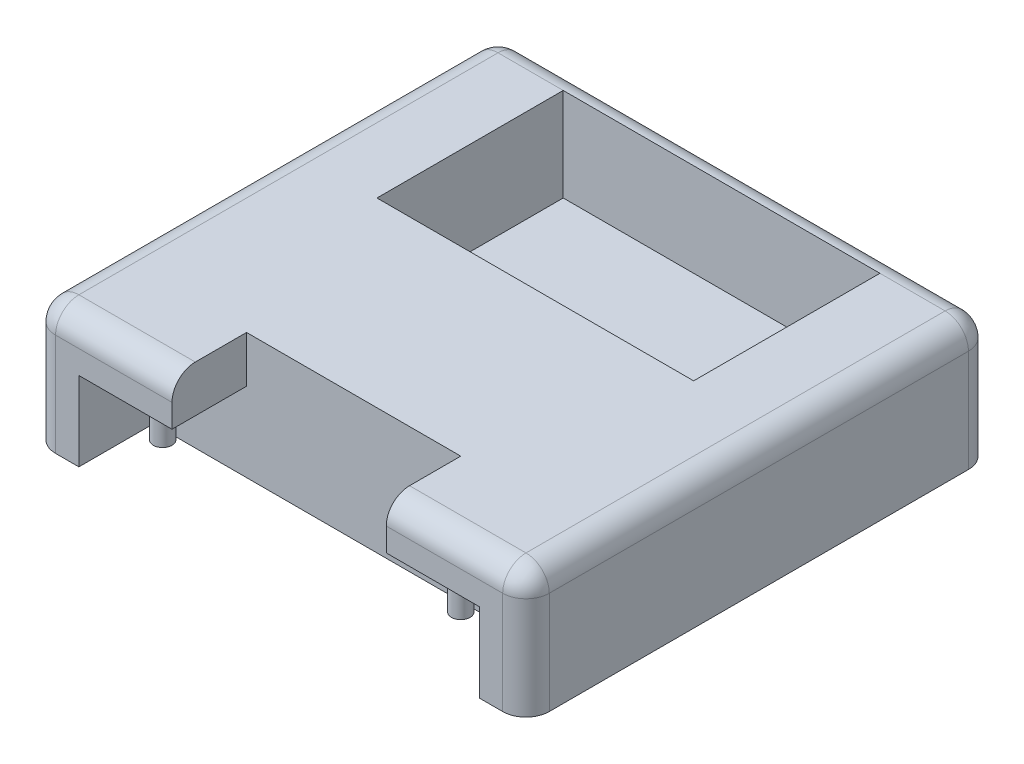
ISO-10303-21;
HEADER;
FILE_DESCRIPTION(('STEP AP214'),'2;1');
FILE_NAME('part.step','',(''),(''),'','','');
FILE_SCHEMA(('AUTOMOTIVE_DESIGN { 1 0 10303 214 1 1 1 1 }'));
ENDSEC;
DATA;
#1=APPLICATION_CONTEXT('core data for automotive mechanical design processes');
#2=APPLICATION_PROTOCOL_DEFINITION('international standard','automotive_design',2000,#1);
#3=PRODUCT_CONTEXT('',#1,'mechanical');
#4=PRODUCT('Part','Part','',(#3));
#5=PRODUCT_RELATED_PRODUCT_CATEGORY('part','',(#4));
#6=PRODUCT_DEFINITION_FORMATION('','',#4);
#7=PRODUCT_DEFINITION_CONTEXT('part definition',#1,'design');
#8=PRODUCT_DEFINITION('design','',#6,#7);
#9=PRODUCT_DEFINITION_SHAPE('','',#8);
#10=(LENGTH_UNIT() NAMED_UNIT(*) SI_UNIT(.MILLI.,.METRE.));
#11=(NAMED_UNIT(*) PLANE_ANGLE_UNIT() SI_UNIT($,.RADIAN.));
#12=(NAMED_UNIT(*) SI_UNIT($,.STERADIAN.) SOLID_ANGLE_UNIT());
#13=UNCERTAINTY_MEASURE_WITH_UNIT(LENGTH_MEASURE(1.E-05),#10,'distance_accuracy_value','');
#14=(GEOMETRIC_REPRESENTATION_CONTEXT(3) GLOBAL_UNCERTAINTY_ASSIGNED_CONTEXT((#13)) GLOBAL_UNIT_ASSIGNED_CONTEXT((#10,
#11,#12)) REPRESENTATION_CONTEXT('',''));
#15=CARTESIAN_POINT('',(0.,0.,0.));
#16=DIRECTION('',(0.,0.,1.));
#17=DIRECTION('',(1.,0.,0.));
#18=AXIS2_PLACEMENT_3D('',#15,#16,#17);
#19=CARTESIAN_POINT('',(0.,0.,0.));
#20=DIRECTION('',(0.,-1.,0.));
#21=DIRECTION('',(0.,0.,-1.));
#22=AXIS2_PLACEMENT_3D('',#19,#20,#21);
#23=PLANE('',#22);
#24=CARTESIAN_POINT('',(32.,0.,43.));
#25=DIRECTION('',(0.,-1.,0.));
#26=DIRECTION('',(0.,0.,-1.));
#27=AXIS2_PLACEMENT_3D('',#24,#25,#26);
#28=CIRCLE('',#27,5.);
#29=CARTESIAN_POINT('',(32.,0.,38.));
#30=VERTEX_POINT('',#29);
#31=EDGE_CURVE('E258',#30,#30,#28,.F.);
#32=ORIENTED_EDGE('',*,*,#31,.T.);
#33=EDGE_LOOP('',(#32));
#34=FACE_BOUND('',#33,.T.);
#35=DIRECTION('',(0.,0.,1.));
#36=VECTOR('',#35,1.);
#37=CARTESIAN_POINT('',(23.,0.,66.));
#38=LINE('',#37,#36);
#39=CARTESIAN_POINT('',(23.,0.,34.));
#40=VERTEX_POINT('',#39);
#41=CARTESIAN_POINT('',(23.,0.,50.));
#42=VERTEX_POINT('',#41);
#43=EDGE_CURVE('E198',#40,#42,#38,.T.);
#44=ORIENTED_EDGE('',*,*,#43,.F.);
#45=DIRECTION('',(-1.,0.,0.));
#46=VECTOR('',#45,1.);
#47=CARTESIAN_POINT('',(-43.,0.,34.));
#48=LINE('',#47,#46);
#49=CARTESIAN_POINT('',(43.,0.,34.));
#50=VERTEX_POINT('',#49);
#51=EDGE_CURVE('E212',#50,#40,#48,.T.);
#52=ORIENTED_EDGE('',*,*,#51,.F.);
#53=DIRECTION('',(0.,0.,-1.));
#54=VECTOR('',#53,1.);
#55=CARTESIAN_POINT('',(43.,0.,50.));
#56=LINE('',#55,#54);
#57=CARTESIAN_POINT('',(43.,0.,50.));
#58=VERTEX_POINT('',#57);
#59=EDGE_CURVE('E227',#58,#50,#56,.T.);
#60=ORIENTED_EDGE('',*,*,#59,.F.);
#61=DIRECTION('',(1.,0.,0.));
#62=VECTOR('',#61,1.);
#63=CARTESIAN_POINT('',(-53.,0.,50.));
#64=LINE('',#63,#62);
#65=EDGE_CURVE('E213',#42,#58,#64,.T.);
#66=ORIENTED_EDGE('',*,*,#65,.F.);
#67=EDGE_LOOP('',(#44,#52,#60,#66));
#68=FACE_BOUND('',#67,.T.);
#69=ADVANCED_FACE('F39',(#34,#68),#23,.T.);
#70=CARTESIAN_POINT('',(-53.,10.,50.));
#71=DIRECTION('',(0.,0.,-1.));
#72=DIRECTION('',(-1.,0.,0.));
#73=AXIS2_PLACEMENT_3D('',#70,#71,#72);
#74=PLANE('',#73);
#75=DIRECTION('',(0.,-1.,0.));
#76=VECTOR('',#75,1.);
#77=CARTESIAN_POINT('',(48.,10.,50.));
#78=LINE('',#77,#76);
#79=CARTESIAN_POINT('',(48.,-17.,50.));
#80=VERTEX_POINT('',#79);
#81=CARTESIAN_POINT('',(48.,5.,50.));
#82=VERTEX_POINT('',#81);
#83=EDGE_CURVE('E280',#80,#82,#78,.F.);
#84=ORIENTED_EDGE('',*,*,#83,.T.);
#85=DIRECTION('',(1.,0.,0.));
#86=VECTOR('',#85,1.);
#87=CARTESIAN_POINT('',(-53.,5.,50.));
#88=LINE('',#87,#86);
#89=CARTESIAN_POINT('',(23.,5.,50.));
#90=VERTEX_POINT('',#89);
#91=EDGE_CURVE('E282',#82,#90,#88,.F.);
#92=ORIENTED_EDGE('',*,*,#91,.T.);
#93=DIRECTION('',(0.,-1.,0.));
#94=VECTOR('',#93,1.);
#95=CARTESIAN_POINT('',(23.,10.,50.));
#96=LINE('',#95,#94);
#97=EDGE_CURVE('E457',#90,#42,#96,.T.);
#98=ORIENTED_EDGE('',*,*,#97,.T.);
#99=ORIENTED_EDGE('',*,*,#65,.T.);
#100=DIRECTION('',(0.,1.,0.));
#101=VECTOR('',#100,1.);
#102=CARTESIAN_POINT('',(43.,-17.,50.));
#103=LINE('',#102,#101);
#104=CARTESIAN_POINT('',(43.,-17.,50.));
#105=VERTEX_POINT('',#104);
#106=EDGE_CURVE('E238',#105,#58,#103,.T.);
#107=ORIENTED_EDGE('',*,*,#106,.F.);
#108=DIRECTION('',(-1.,0.,0.));
#109=VECTOR('',#108,1.);
#110=CARTESIAN_POINT('',(53.,-17.,50.));
#111=LINE('',#110,#109);
#112=EDGE_CURVE('E383',#80,#105,#111,.T.);
#113=ORIENTED_EDGE('',*,*,#112,.F.);
#114=EDGE_LOOP('',(#84,#92,#98,#99,#107,#113));
#115=FACE_BOUND('',#114,.T.);
#116=ADVANCED_FACE('F470',(#115),#74,.F.);
#117=CARTESIAN_POINT('',(-32.,0.,43.));
#118=DIRECTION('',(0.,-1.,0.));
#119=DIRECTION('',(0.,0.,-1.));
#120=AXIS2_PLACEMENT_3D('',#117,#118,#119);
#121=CIRCLE('',#120,5.);
#122=CARTESIAN_POINT('',(-32.,0.,38.));
#123=VERTEX_POINT('',#122);
#124=EDGE_CURVE('E264',#123,#123,#121,.F.);
#125=ORIENTED_EDGE('',*,*,#124,.T.);
#126=EDGE_LOOP('',(#125));
#127=FACE_BOUND('',#126,.T.);
#128=DIRECTION('',(0.,0.,-1.));
#129=VECTOR('',#128,1.);
#130=CARTESIAN_POINT('',(-23.,0.,66.));
#131=LINE('',#130,#129);
#132=CARTESIAN_POINT('',(-23.,0.,50.));
#133=VERTEX_POINT('',#132);
#134=CARTESIAN_POINT('',(-23.,0.,34.));
#135=VERTEX_POINT('',#134);
#136=EDGE_CURVE('E214',#133,#135,#131,.T.);
#137=ORIENTED_EDGE('',*,*,#136,.F.);
#138=CARTESIAN_POINT('',(-43.,0.,50.));
#139=VERTEX_POINT('',#138);
#140=EDGE_CURVE('E247',#139,#133,#64,.T.);
#141=ORIENTED_EDGE('',*,*,#140,.F.);
#142=DIRECTION('',(0.,0.,1.));
#143=VECTOR('',#142,1.);
#144=CARTESIAN_POINT('',(-43.,0.,50.));
#145=LINE('',#144,#143);
#146=CARTESIAN_POINT('',(-43.,0.,34.));
#147=VERTEX_POINT('',#146);
#148=EDGE_CURVE('E221',#147,#139,#145,.T.);
#149=ORIENTED_EDGE('',*,*,#148,.F.);
#150=EDGE_CURVE('E222',#135,#147,#48,.T.);
#151=ORIENTED_EDGE('',*,*,#150,.F.);
#152=EDGE_LOOP('',(#137,#141,#149,#151));
#153=FACE_BOUND('',#152,.T.);
#154=ADVANCED_FACE('F413',(#127,#153),#23,.T.);
#155=CARTESIAN_POINT('',(53.,10.,50.));
#156=DIRECTION('',(-1.,0.,0.));
#157=DIRECTION('',(0.,0.,1.));
#158=AXIS2_PLACEMENT_3D('',#155,#156,#157);
#159=PLANE('',#158);
#160=DIRECTION('',(0.,0.,1.));
#161=VECTOR('',#160,1.);
#162=CARTESIAN_POINT('',(53.,-17.,50.));
#163=LINE('',#162,#161);
#164=CARTESIAN_POINT('',(53.,-17.,-45.));
#165=VERTEX_POINT('',#164);
#166=CARTESIAN_POINT('',(53.,-17.,45.));
#167=VERTEX_POINT('',#166);
#168=EDGE_CURVE('E375',#165,#167,#163,.T.);
#169=ORIENTED_EDGE('',*,*,#168,.F.);
#170=DIRECTION('',(0.,-1.,0.));
#171=VECTOR('',#170,1.);
#172=CARTESIAN_POINT('',(53.,10.,-45.));
#173=LINE('',#172,#171);
#174=CARTESIAN_POINT('',(53.,5.,-45.));
#175=VERTEX_POINT('',#174);
#176=EDGE_CURVE('E310',#165,#175,#173,.F.);
#177=ORIENTED_EDGE('',*,*,#176,.T.);
#178=DIRECTION('',(0.,0.,-1.));
#179=VECTOR('',#178,1.);
#180=CARTESIAN_POINT('',(53.,5.,50.));
#181=LINE('',#180,#179);
#182=CARTESIAN_POINT('',(53.,5.,45.));
#183=VERTEX_POINT('',#182);
#184=EDGE_CURVE('E306',#175,#183,#181,.F.);
#185=ORIENTED_EDGE('',*,*,#184,.T.);
#186=DIRECTION('',(0.,-1.,0.));
#187=VECTOR('',#186,1.);
#188=CARTESIAN_POINT('',(53.,10.,45.));
#189=LINE('',#188,#187);
#190=EDGE_CURVE('E308',#183,#167,#189,.T.);
#191=ORIENTED_EDGE('',*,*,#190,.T.);
#192=EDGE_LOOP('',(#169,#177,#185,#191));
#193=FACE_BOUND('',#192,.T.);
#194=ADVANCED_FACE('F494',(#193),#159,.F.);
#195=CARTESIAN_POINT('',(-53.,10.,-50.));
#196=DIRECTION('',(0.,0.,1.));
#197=DIRECTION('',(1.,0.,0.));
#198=AXIS2_PLACEMENT_3D('',#195,#196,#197);
#199=PLANE('',#198);
#200=DIRECTION('',(-1.,0.,0.));
#201=VECTOR('',#200,1.);
#202=CARTESIAN_POINT('',(-53.,5.,-50.));
#203=LINE('',#202,#201);
#204=CARTESIAN_POINT('',(-48.,5.,-50.));
#205=VERTEX_POINT('',#204);
#206=CARTESIAN_POINT('',(48.,5.,-50.));
#207=VERTEX_POINT('',#206);
#208=EDGE_CURVE('E292',#205,#207,#203,.F.);
#209=ORIENTED_EDGE('',*,*,#208,.T.);
#210=DIRECTION('',(0.,-1.,0.));
#211=VECTOR('',#210,1.);
#212=CARTESIAN_POINT('',(48.,10.,-50.));
#213=LINE('',#212,#211);
#214=CARTESIAN_POINT('',(48.,-17.,-50.));
#215=VERTEX_POINT('',#214);
#216=EDGE_CURVE('E296',#207,#215,#213,.T.);
#217=ORIENTED_EDGE('',*,*,#216,.T.);
#218=DIRECTION('',(1.,0.,0.));
#219=VECTOR('',#218,1.);
#220=CARTESIAN_POINT('',(-53.,-17.,-50.));
#221=LINE('',#220,#219);
#222=CARTESIAN_POINT('',(-48.,-17.,-50.));
#223=VERTEX_POINT('',#222);
#224=EDGE_CURVE('E373',#223,#215,#221,.T.);
#225=ORIENTED_EDGE('',*,*,#224,.F.);
#226=DIRECTION('',(0.,-1.,0.));
#227=VECTOR('',#226,1.);
#228=CARTESIAN_POINT('',(-48.,10.,-50.));
#229=LINE('',#228,#227);
#230=EDGE_CURVE('E294',#223,#205,#229,.F.);
#231=ORIENTED_EDGE('',*,*,#230,.T.);
#232=EDGE_LOOP('',(#209,#217,#225,#231));
#233=FACE_BOUND('',#232,.T.);
#234=ADVANCED_FACE('F506',(#233),#199,.F.);
#235=CARTESIAN_POINT('',(-53.,10.,50.));
#236=DIRECTION('',(1.,0.,0.));
#237=DIRECTION('',(0.,0.,-1.));
#238=AXIS2_PLACEMENT_3D('',#235,#236,#237);
#239=PLANE('',#238);
#240=DIRECTION('',(0.,0.,-1.));
#241=VECTOR('',#240,1.);
#242=CARTESIAN_POINT('',(-53.,-17.,50.));
#243=LINE('',#242,#241);
#244=CARTESIAN_POINT('',(-53.,-17.,45.));
#245=VERTEX_POINT('',#244);
#246=CARTESIAN_POINT('',(-53.,-17.,-45.));
#247=VERTEX_POINT('',#246);
#248=EDGE_CURVE('E225',#245,#247,#243,.T.);
#249=ORIENTED_EDGE('',*,*,#248,.F.);
#250=DIRECTION('',(0.,-1.,0.));
#251=VECTOR('',#250,1.);
#252=CARTESIAN_POINT('',(-53.,10.,45.));
#253=LINE('',#252,#251);
#254=CARTESIAN_POINT('',(-53.,5.,45.));
#255=VERTEX_POINT('',#254);
#256=EDGE_CURVE('E11',#245,#255,#253,.F.);
#257=ORIENTED_EDGE('',*,*,#256,.T.);
#258=DIRECTION('',(0.,0.,1.));
#259=VECTOR('',#258,1.);
#260=CARTESIAN_POINT('',(-53.,5.,50.));
#261=LINE('',#260,#259);
#262=CARTESIAN_POINT('',(-53.,5.,-45.));
#263=VERTEX_POINT('',#262);
#264=EDGE_CURVE('E55',#255,#263,#261,.F.);
#265=ORIENTED_EDGE('',*,*,#264,.T.);
#266=DIRECTION('',(0.,-1.,0.));
#267=VECTOR('',#266,1.);
#268=CARTESIAN_POINT('',(-53.,10.,-45.));
#269=LINE('',#268,#267);
#270=EDGE_CURVE('E48',#263,#247,#269,.T.);
#271=ORIENTED_EDGE('',*,*,#270,.T.);
#272=EDGE_LOOP('',(#249,#257,#265,#271));
#273=FACE_BOUND('',#272,.T.);
#274=ADVANCED_FACE('F366',(#273),#239,.F.);
#275=DIRECTION('',(0.,1.,0.));
#276=VECTOR('',#275,1.);
#277=CARTESIAN_POINT('',(-23.,10.,50.));
#278=LINE('',#277,#276);
#279=CARTESIAN_POINT('',(-23.,5.,50.));
#280=VERTEX_POINT('',#279);
#281=EDGE_CURVE('E206',#133,#280,#278,.T.);
#282=ORIENTED_EDGE('',*,*,#281,.T.);
#283=DIRECTION('',(1.,0.,0.));
#284=VECTOR('',#283,1.);
#285=CARTESIAN_POINT('',(-53.,5.,50.));
#286=LINE('',#285,#284);
#287=CARTESIAN_POINT('',(-48.,5.,50.));
#288=VERTEX_POINT('',#287);
#289=EDGE_CURVE('E290',#280,#288,#286,.F.);
#290=ORIENTED_EDGE('',*,*,#289,.T.);
#291=DIRECTION('',(0.,-1.,0.));
#292=VECTOR('',#291,1.);
#293=CARTESIAN_POINT('',(-48.,10.,50.));
#294=LINE('',#293,#292);
#295=CARTESIAN_POINT('',(-48.,-17.,50.));
#296=VERTEX_POINT('',#295);
#297=EDGE_CURVE('E288',#288,#296,#294,.T.);
#298=ORIENTED_EDGE('',*,*,#297,.T.);
#299=DIRECTION('',(-1.,0.,0.));
#300=VECTOR('',#299,1.);
#301=CARTESIAN_POINT('',(-53.,-17.,50.));
#302=LINE('',#301,#300);
#303=CARTESIAN_POINT('',(-43.,-17.,50.));
#304=VERTEX_POINT('',#303);
#305=EDGE_CURVE('E234',#304,#296,#302,.T.);
#306=ORIENTED_EDGE('',*,*,#305,.F.);
#307=DIRECTION('',(0.,1.,0.));
#308=VECTOR('',#307,1.);
#309=CARTESIAN_POINT('',(-43.,-17.,50.));
#310=LINE('',#309,#308);
#311=EDGE_CURVE('E231',#304,#139,#310,.T.);
#312=ORIENTED_EDGE('',*,*,#311,.T.);
#313=ORIENTED_EDGE('',*,*,#140,.T.);
#314=EDGE_LOOP('',(#282,#290,#298,#306,#312,#313));
#315=FACE_BOUND('',#314,.T.);
#316=ADVANCED_FACE('F398',(#315),#74,.F.);
#317=CARTESIAN_POINT('',(0.,10.,0.));
#318=DIRECTION('',(0.,-1.,0.));
#319=DIRECTION('',(0.,0.,-1.));
#320=AXIS2_PLACEMENT_3D('',#317,#318,#319);
#321=PLANE('',#320);
#322=DIRECTION('',(0.,0.,1.));
#323=VECTOR('',#322,1.);
#324=CARTESIAN_POINT('',(23.,10.,0.));
#325=LINE('',#324,#323);
#326=CARTESIAN_POINT('',(23.,10.,34.));
#327=VERTEX_POINT('',#326);
#328=CARTESIAN_POINT('',(23.,10.,45.));
#329=VERTEX_POINT('',#328);
#330=EDGE_CURVE('E201',#327,#329,#325,.T.);
#331=ORIENTED_EDGE('',*,*,#330,.T.);
#332=DIRECTION('',(1.,0.,0.));
#333=VECTOR('',#332,1.);
#334=CARTESIAN_POINT('',(0.,10.,45.));
#335=LINE('',#334,#333);
#336=CARTESIAN_POINT('',(48.,10.,45.));
#337=VERTEX_POINT('',#336);
#338=EDGE_CURVE('E277',#329,#337,#335,.T.);
#339=ORIENTED_EDGE('',*,*,#338,.T.);
#340=DIRECTION('',(0.,0.,-1.));
#341=VECTOR('',#340,1.);
#342=CARTESIAN_POINT('',(48.,10.,0.));
#343=LINE('',#342,#341);
#344=CARTESIAN_POINT('',(48.,10.,-45.));
#345=VERTEX_POINT('',#344);
#346=EDGE_CURVE('E273',#337,#345,#343,.T.);
#347=ORIENTED_EDGE('',*,*,#346,.T.);
#348=DIRECTION('',(-1.,0.,0.));
#349=VECTOR('',#348,1.);
#350=CARTESIAN_POINT('',(0.,10.,-45.));
#351=LINE('',#350,#349);
#352=CARTESIAN_POINT('',(34.,10.,-45.));
#353=VERTEX_POINT('',#352);
#354=EDGE_CURVE('E275',#345,#353,#351,.T.);
#355=ORIENTED_EDGE('',*,*,#354,.T.);
#356=DIRECTION('',(0.,0.,-1.));
#357=VECTOR('',#356,1.);
#358=CARTESIAN_POINT('',(34.,10.,-4.99999999999999));
#359=LINE('',#358,#357);
#360=CARTESIAN_POINT('',(34.,10.,-4.99999999999999));
#361=VERTEX_POINT('',#360);
#362=EDGE_CURVE('E454',#361,#353,#359,.T.);
#363=ORIENTED_EDGE('',*,*,#362,.F.);
#364=DIRECTION('',(1.,0.,0.));
#365=VECTOR('',#364,1.);
#366=CARTESIAN_POINT('',(-34.,10.,-4.99999999999999));
#367=LINE('',#366,#365);
#368=CARTESIAN_POINT('',(-34.,10.,-4.99999999999999));
#369=VERTEX_POINT('',#368);
#370=EDGE_CURVE('E432',#369,#361,#367,.T.);
#371=ORIENTED_EDGE('',*,*,#370,.F.);
#372=DIRECTION('',(0.,0.,1.));
#373=VECTOR('',#372,1.);
#374=CARTESIAN_POINT('',(-34.,10.,-4.99999999999999));
#375=LINE('',#374,#373);
#376=CARTESIAN_POINT('',(-34.,10.,-45.));
#377=VERTEX_POINT('',#376);
#378=EDGE_CURVE('E458',#377,#369,#375,.T.);
#379=ORIENTED_EDGE('',*,*,#378,.F.);
#380=DIRECTION('',(-1.,0.,0.));
#381=VECTOR('',#380,1.);
#382=CARTESIAN_POINT('',(0.,10.,-45.));
#383=LINE('',#382,#381);
#384=CARTESIAN_POINT('',(-48.,10.,-45.));
#385=VERTEX_POINT('',#384);
#386=EDGE_CURVE('E269',#377,#385,#383,.T.);
#387=ORIENTED_EDGE('',*,*,#386,.T.);
#388=DIRECTION('',(0.,0.,1.));
#389=VECTOR('',#388,1.);
#390=CARTESIAN_POINT('',(-48.,10.,0.));
#391=LINE('',#390,#389);
#392=CARTESIAN_POINT('',(-48.,10.,45.));
#393=VERTEX_POINT('',#392);
#394=EDGE_CURVE('E267',#385,#393,#391,.T.);
#395=ORIENTED_EDGE('',*,*,#394,.T.);
#396=DIRECTION('',(1.,0.,0.));
#397=VECTOR('',#396,1.);
#398=CARTESIAN_POINT('',(0.,10.,45.));
#399=LINE('',#398,#397);
#400=CARTESIAN_POINT('',(-23.,10.,45.));
#401=VERTEX_POINT('',#400);
#402=EDGE_CURVE('E271',#393,#401,#399,.T.);
#403=ORIENTED_EDGE('',*,*,#402,.T.);
#404=DIRECTION('',(0.,0.,-1.));
#405=VECTOR('',#404,1.);
#406=CARTESIAN_POINT('',(-23.,10.,0.));
#407=LINE('',#406,#405);
#408=CARTESIAN_POINT('',(-23.,10.,34.));
#409=VERTEX_POINT('',#408);
#410=EDGE_CURVE('E250',#401,#409,#407,.T.);
#411=ORIENTED_EDGE('',*,*,#410,.T.);
#412=DIRECTION('',(1.,0.,0.));
#413=VECTOR('',#412,1.);
#414=CARTESIAN_POINT('',(0.,10.,34.));
#415=LINE('',#414,#413);
#416=EDGE_CURVE('E252',#409,#327,#415,.T.);
#417=ORIENTED_EDGE('',*,*,#416,.T.);
#418=EDGE_LOOP('',(#331,#339,#347,#355,#363,#371,#379,#387,#395,#403,#411,#417));
#419=FACE_BOUND('',#418,.T.);
#420=ADVANCED_FACE('F407',(#419),#321,.F.);
#421=CARTESIAN_POINT('',(32.,-10.,43.));
#422=DIRECTION('',(0.,1.,0.));
#423=DIRECTION('',(0.,0.,1.));
#424=AXIS2_PLACEMENT_3D('',#421,#422,#423);
#425=CYLINDRICAL_SURFACE('',#424,2.);
#426=CARTESIAN_POINT('',(32.,-3.,43.));
#427=DIRECTION('',(0.,-1.,0.));
#428=DIRECTION('',(0.,0.,-1.));
#429=AXIS2_PLACEMENT_3D('',#426,#427,#428);
#430=CIRCLE('',#429,2.);
#431=CARTESIAN_POINT('',(32.,-3.,41.));
#432=VERTEX_POINT('',#431);
#433=EDGE_CURVE('E255',#432,#432,#430,.T.);
#434=ORIENTED_EDGE('',*,*,#433,.T.);
#435=EDGE_LOOP('',(#434));
#436=FACE_BOUND('',#435,.T.);
#437=CARTESIAN_POINT('',(32.,-10.,43.));
#438=DIRECTION('',(0.,-1.,0.));
#439=DIRECTION('',(0.,0.,-1.));
#440=AXIS2_PLACEMENT_3D('',#437,#438,#439);
#441=CIRCLE('',#440,2.);
#442=CARTESIAN_POINT('',(32.,-10.,41.));
#443=VERTEX_POINT('',#442);
#444=EDGE_CURVE('E241',#443,#443,#441,.T.);
#445=ORIENTED_EDGE('',*,*,#444,.F.);
#446=EDGE_LOOP('',(#445));
#447=FACE_BOUND('',#446,.T.);
#448=ADVANCED_FACE('F563',(#436,#447),#425,.T.);
#449=CARTESIAN_POINT('',(32.,-10.,43.));
#450=DIRECTION('',(0.,-1.,0.));
#451=DIRECTION('',(0.,0.,-1.));
#452=AXIS2_PLACEMENT_3D('',#449,#450,#451);
#453=PLANE('',#452);
#454=ORIENTED_EDGE('',*,*,#444,.T.);
#455=EDGE_LOOP('',(#454));
#456=FACE_BOUND('',#455,.T.);
#457=ADVANCED_FACE('F550',(#456),#453,.T.);
#458=CARTESIAN_POINT('',(-32.,-10.,43.));
#459=DIRECTION('',(0.,1.,0.));
#460=DIRECTION('',(0.,0.,1.));
#461=AXIS2_PLACEMENT_3D('',#458,#459,#460);
#462=CYLINDRICAL_SURFACE('',#461,2.);
#463=CARTESIAN_POINT('',(-32.,-3.,43.));
#464=DIRECTION('',(0.,-1.,0.));
#465=DIRECTION('',(0.,0.,-1.));
#466=AXIS2_PLACEMENT_3D('',#463,#464,#465);
#467=CIRCLE('',#466,2.);
#468=CARTESIAN_POINT('',(-32.,-3.,41.));
#469=VERTEX_POINT('',#468);
#470=EDGE_CURVE('E261',#469,#469,#467,.T.);
#471=ORIENTED_EDGE('',*,*,#470,.T.);
#472=EDGE_LOOP('',(#471));
#473=FACE_BOUND('',#472,.T.);
#474=CARTESIAN_POINT('',(-32.,-10.,43.));
#475=DIRECTION('',(0.,-1.,0.));
#476=DIRECTION('',(0.,0.,-1.));
#477=AXIS2_PLACEMENT_3D('',#474,#475,#476);
#478=CIRCLE('',#477,2.);
#479=CARTESIAN_POINT('',(-32.,-10.,41.));
#480=VERTEX_POINT('',#479);
#481=EDGE_CURVE('E242',#480,#480,#478,.T.);
#482=ORIENTED_EDGE('',*,*,#481,.F.);
#483=EDGE_LOOP('',(#482));
#484=FACE_BOUND('',#483,.T.);
#485=ADVANCED_FACE('F546',(#473,#484),#462,.T.);
#486=CARTESIAN_POINT('',(-32.,-10.,43.));
#487=DIRECTION('',(0.,-1.,0.));
#488=DIRECTION('',(0.,0.,-1.));
#489=AXIS2_PLACEMENT_3D('',#486,#487,#488);
#490=PLANE('',#489);
#491=ORIENTED_EDGE('',*,*,#481,.T.);
#492=EDGE_LOOP('',(#491));
#493=FACE_BOUND('',#492,.T.);
#494=ADVANCED_FACE('F549',(#493),#490,.T.);
#495=CARTESIAN_POINT('',(43.,-17.,50.));
#496=DIRECTION('',(1.,0.,0.));
#497=DIRECTION('',(0.,0.,-1.));
#498=AXIS2_PLACEMENT_3D('',#495,#496,#497);
#499=PLANE('',#498);
#500=ORIENTED_EDGE('',*,*,#59,.T.);
#501=DIRECTION('',(0.,1.,0.));
#502=VECTOR('',#501,1.);
#503=CARTESIAN_POINT('',(43.,-17.,34.));
#504=LINE('',#503,#502);
#505=CARTESIAN_POINT('',(43.,-17.,34.));
#506=VERTEX_POINT('',#505);
#507=EDGE_CURVE('E220',#506,#50,#504,.T.);
#508=ORIENTED_EDGE('',*,*,#507,.F.);
#509=DIRECTION('',(0.,0.,-1.));
#510=VECTOR('',#509,1.);
#511=CARTESIAN_POINT('',(43.,-17.,50.));
#512=LINE('',#511,#510);
#513=EDGE_CURVE('E385',#105,#506,#512,.T.);
#514=ORIENTED_EDGE('',*,*,#513,.F.);
#515=ORIENTED_EDGE('',*,*,#106,.T.);
#516=EDGE_LOOP('',(#500,#508,#514,#515));
#517=FACE_BOUND('',#516,.T.);
#518=ADVANCED_FACE('F421',(#517),#499,.F.);
#519=CARTESIAN_POINT('',(-43.,-17.,34.));
#520=DIRECTION('',(0.,0.,-1.));
#521=DIRECTION('',(-1.,0.,0.));
#522=AXIS2_PLACEMENT_3D('',#519,#520,#521);
#523=PLANE('',#522);
#524=ORIENTED_EDGE('',*,*,#51,.T.);
#525=DIRECTION('',(0.,-1.,0.));
#526=VECTOR('',#525,1.);
#527=CARTESIAN_POINT('',(23.,20.,34.));
#528=LINE('',#527,#526);
#529=EDGE_CURVE('E194',#327,#40,#528,.T.);
#530=ORIENTED_EDGE('',*,*,#529,.F.);
#531=ORIENTED_EDGE('',*,*,#416,.F.);
#532=DIRECTION('',(0.,-1.,0.));
#533=VECTOR('',#532,1.);
#534=CARTESIAN_POINT('',(-23.,20.,34.));
#535=LINE('',#534,#533);
#536=EDGE_CURVE('E207',#409,#135,#535,.T.);
#537=ORIENTED_EDGE('',*,*,#536,.T.);
#538=ORIENTED_EDGE('',*,*,#150,.T.);
#539=DIRECTION('',(0.,1.,0.));
#540=VECTOR('',#539,1.);
#541=CARTESIAN_POINT('',(-43.,-17.,34.));
#542=LINE('',#541,#540);
#543=CARTESIAN_POINT('',(-43.,-17.,34.));
#544=VERTEX_POINT('',#543);
#545=EDGE_CURVE('E233',#544,#147,#542,.T.);
#546=ORIENTED_EDGE('',*,*,#545,.F.);
#547=DIRECTION('',(-1.,0.,0.));
#548=VECTOR('',#547,1.);
#549=CARTESIAN_POINT('',(-43.,-17.,34.));
#550=LINE('',#549,#548);
#551=EDGE_CURVE('E387',#506,#544,#550,.T.);
#552=ORIENTED_EDGE('',*,*,#551,.F.);
#553=ORIENTED_EDGE('',*,*,#507,.T.);
#554=EDGE_LOOP('',(#524,#530,#531,#537,#538,#546,#552,#553));
#555=FACE_BOUND('',#554,.T.);
#556=ADVANCED_FACE('F217',(#555),#523,.F.);
#557=CARTESIAN_POINT('',(-43.,-17.,50.));
#558=DIRECTION('',(-1.,0.,0.));
#559=DIRECTION('',(0.,0.,1.));
#560=AXIS2_PLACEMENT_3D('',#557,#558,#559);
#561=PLANE('',#560);
#562=ORIENTED_EDGE('',*,*,#148,.T.);
#563=ORIENTED_EDGE('',*,*,#311,.F.);
#564=DIRECTION('',(0.,0.,1.));
#565=VECTOR('',#564,1.);
#566=CARTESIAN_POINT('',(-43.,-17.,50.));
#567=LINE('',#566,#565);
#568=EDGE_CURVE('E389',#544,#304,#567,.T.);
#569=ORIENTED_EDGE('',*,*,#568,.F.);
#570=ORIENTED_EDGE('',*,*,#545,.T.);
#571=EDGE_LOOP('',(#562,#563,#569,#570));
#572=FACE_BOUND('',#571,.T.);
#573=ADVANCED_FACE('F416',(#572),#561,.F.);
#574=CARTESIAN_POINT('',(0.,-17.,0.));
#575=DIRECTION('',(0.,-1.,0.));
#576=DIRECTION('',(0.,0.,-1.));
#577=AXIS2_PLACEMENT_3D('',#574,#575,#576);
#578=PLANE('',#577);
#579=ORIENTED_EDGE('',*,*,#224,.T.);
#580=CARTESIAN_POINT('',(48.,-17.,-45.));
#581=DIRECTION('',(0.,-1.,0.));
#582=DIRECTION('',(0.,0.,-1.));
#583=AXIS2_PLACEMENT_3D('',#580,#581,#582);
#584=CIRCLE('',#583,5.);
#585=EDGE_CURVE('E304',#215,#165,#584,.T.);
#586=ORIENTED_EDGE('',*,*,#585,.T.);
#587=ORIENTED_EDGE('',*,*,#168,.T.);
#588=CARTESIAN_POINT('',(48.,-17.,45.));
#589=DIRECTION('',(0.,-1.,0.));
#590=DIRECTION('',(0.,0.,-1.));
#591=AXIS2_PLACEMENT_3D('',#588,#589,#590);
#592=CIRCLE('',#591,5.);
#593=EDGE_CURVE('E302',#167,#80,#592,.T.);
#594=ORIENTED_EDGE('',*,*,#593,.T.);
#595=ORIENTED_EDGE('',*,*,#112,.T.);
#596=ORIENTED_EDGE('',*,*,#513,.T.);
#597=ORIENTED_EDGE('',*,*,#551,.T.);
#598=ORIENTED_EDGE('',*,*,#568,.T.);
#599=ORIENTED_EDGE('',*,*,#305,.T.);
#600=CARTESIAN_POINT('',(-48.,-17.,45.));
#601=DIRECTION('',(0.,-1.,0.));
#602=DIRECTION('',(0.,0.,-1.));
#603=AXIS2_PLACEMENT_3D('',#600,#601,#602);
#604=CIRCLE('',#603,5.);
#605=EDGE_CURVE('E300',#296,#245,#604,.T.);
#606=ORIENTED_EDGE('',*,*,#605,.T.);
#607=ORIENTED_EDGE('',*,*,#248,.T.);
#608=CARTESIAN_POINT('',(-48.,-17.,-45.));
#609=DIRECTION('',(0.,-1.,0.));
#610=DIRECTION('',(0.,0.,-1.));
#611=AXIS2_PLACEMENT_3D('',#608,#609,#610);
#612=CIRCLE('',#611,5.);
#613=EDGE_CURVE('E298',#247,#223,#612,.T.);
#614=ORIENTED_EDGE('',*,*,#613,.T.);
#615=EDGE_LOOP('',(#579,#586,#587,#594,#595,#596,#597,#598,#599,#606,#607,#614));
#616=FACE_BOUND('',#615,.T.);
#617=ADVANCED_FACE('F369',(#616),#578,.T.);
#618=CARTESIAN_POINT('',(34.,-10.,-4.99999999999999));
#619=DIRECTION('',(1.,0.,0.));
#620=DIRECTION('',(0.,0.,-1.));
#621=AXIS2_PLACEMENT_3D('',#618,#619,#620);
#622=PLANE('',#621);
#623=ORIENTED_EDGE('',*,*,#362,.T.);
#624=DIRECTION('',(0.,1.,0.));
#625=VECTOR('',#624,1.);
#626=CARTESIAN_POINT('',(34.,-10.,-45.));
#627=LINE('',#626,#625);
#628=CARTESIAN_POINT('',(34.,-10.,-45.));
#629=VERTEX_POINT('',#628);
#630=EDGE_CURVE('E378',#629,#353,#627,.T.);
#631=ORIENTED_EDGE('',*,*,#630,.F.);
#632=DIRECTION('',(0.,0.,-1.));
#633=VECTOR('',#632,1.);
#634=CARTESIAN_POINT('',(34.,-10.,-4.99999999999999));
#635=LINE('',#634,#633);
#636=CARTESIAN_POINT('',(34.,-10.,-4.99999999999999));
#637=VERTEX_POINT('',#636);
#638=EDGE_CURVE('E461',#637,#629,#635,.T.);
#639=ORIENTED_EDGE('',*,*,#638,.F.);
#640=DIRECTION('',(0.,1.,0.));
#641=VECTOR('',#640,1.);
#642=CARTESIAN_POINT('',(34.,-10.,-4.99999999999999));
#643=LINE('',#642,#641);
#644=EDGE_CURVE('E422',#637,#361,#643,.T.);
#645=ORIENTED_EDGE('',*,*,#644,.T.);
#646=EDGE_LOOP('',(#623,#631,#639,#645));
#647=FACE_BOUND('',#646,.T.);
#648=ADVANCED_FACE('F507',(#647),#622,.F.);
#649=CARTESIAN_POINT('',(-34.,-10.,-4.99999999999999));
#650=DIRECTION('',(0.,0.,1.));
#651=DIRECTION('',(1.,0.,0.));
#652=AXIS2_PLACEMENT_3D('',#649,#650,#651);
#653=PLANE('',#652);
#654=ORIENTED_EDGE('',*,*,#370,.T.);
#655=ORIENTED_EDGE('',*,*,#644,.F.);
#656=DIRECTION('',(1.,0.,0.));
#657=VECTOR('',#656,1.);
#658=CARTESIAN_POINT('',(-34.,-10.,-4.99999999999999));
#659=LINE('',#658,#657);
#660=CARTESIAN_POINT('',(-34.,-10.,-4.99999999999999));
#661=VERTEX_POINT('',#660);
#662=EDGE_CURVE('E439',#661,#637,#659,.T.);
#663=ORIENTED_EDGE('',*,*,#662,.F.);
#664=DIRECTION('',(0.,1.,0.));
#665=VECTOR('',#664,1.);
#666=CARTESIAN_POINT('',(-34.,-10.,-4.99999999999999));
#667=LINE('',#666,#665);
#668=EDGE_CURVE('E423',#661,#369,#667,.T.);
#669=ORIENTED_EDGE('',*,*,#668,.T.);
#670=EDGE_LOOP('',(#654,#655,#663,#669));
#671=FACE_BOUND('',#670,.T.);
#672=ADVANCED_FACE('F510',(#671),#653,.F.);
#673=CARTESIAN_POINT('',(-34.,-10.,-4.99999999999999));
#674=DIRECTION('',(-1.,0.,0.));
#675=DIRECTION('',(0.,0.,1.));
#676=AXIS2_PLACEMENT_3D('',#673,#674,#675);
#677=PLANE('',#676);
#678=ORIENTED_EDGE('',*,*,#378,.T.);
#679=ORIENTED_EDGE('',*,*,#668,.F.);
#680=DIRECTION('',(0.,0.,1.));
#681=VECTOR('',#680,1.);
#682=CARTESIAN_POINT('',(-34.,-10.,-4.99999999999999));
#683=LINE('',#682,#681);
#684=CARTESIAN_POINT('',(-34.,-10.,-45.));
#685=VERTEX_POINT('',#684);
#686=EDGE_CURVE('E444',#685,#661,#683,.T.);
#687=ORIENTED_EDGE('',*,*,#686,.F.);
#688=DIRECTION('',(0.,1.,0.));
#689=VECTOR('',#688,1.);
#690=CARTESIAN_POINT('',(-34.,-10.,-45.));
#691=LINE('',#690,#689);
#692=EDGE_CURVE('E429',#685,#377,#691,.T.);
#693=ORIENTED_EDGE('',*,*,#692,.T.);
#694=EDGE_LOOP('',(#678,#679,#687,#693));
#695=FACE_BOUND('',#694,.T.);
#696=ADVANCED_FACE('F511',(#695),#677,.F.);
#697=CARTESIAN_POINT('',(-34.,-10.,-45.));
#698=DIRECTION('',(0.,0.,-1.));
#699=DIRECTION('',(-1.,0.,0.));
#700=AXIS2_PLACEMENT_3D('',#697,#698,#699);
#701=PLANE('',#700);
#702=DIRECTION('',(-1.,0.,0.));
#703=VECTOR('',#702,1.);
#704=CARTESIAN_POINT('',(-34.,10.,-45.));
#705=LINE('',#704,#703);
#706=EDGE_CURVE('E456',#353,#377,#705,.T.);
#707=ORIENTED_EDGE('',*,*,#706,.T.);
#708=ORIENTED_EDGE('',*,*,#692,.F.);
#709=DIRECTION('',(-1.,0.,0.));
#710=VECTOR('',#709,1.);
#711=CARTESIAN_POINT('',(-34.,-10.,-45.));
#712=LINE('',#711,#710);
#713=EDGE_CURVE('E450',#629,#685,#712,.T.);
#714=ORIENTED_EDGE('',*,*,#713,.F.);
#715=ORIENTED_EDGE('',*,*,#630,.T.);
#716=EDGE_LOOP('',(#707,#708,#714,#715));
#717=FACE_BOUND('',#716,.T.);
#718=ADVANCED_FACE('F508',(#717),#701,.F.);
#719=CARTESIAN_POINT('',(0.,-10.,0.));
#720=DIRECTION('',(0.,-1.,0.));
#721=DIRECTION('',(0.,0.,-1.));
#722=AXIS2_PLACEMENT_3D('',#719,#720,#721);
#723=PLANE('',#722);
#724=ORIENTED_EDGE('',*,*,#638,.T.);
#725=ORIENTED_EDGE('',*,*,#713,.T.);
#726=ORIENTED_EDGE('',*,*,#686,.T.);
#727=ORIENTED_EDGE('',*,*,#662,.T.);
#728=EDGE_LOOP('',(#724,#725,#726,#727));
#729=FACE_BOUND('',#728,.T.);
#730=ADVANCED_FACE('F509',(#729),#723,.F.);
#731=CARTESIAN_POINT('',(23.,20.,66.));
#732=DIRECTION('',(1.,0.,0.));
#733=DIRECTION('',(0.,0.,-1.));
#734=AXIS2_PLACEMENT_3D('',#731,#732,#733);
#735=PLANE('',#734);
#736=ORIENTED_EDGE('',*,*,#97,.F.);
#737=CARTESIAN_POINT('',(23.,5.,45.));
#738=DIRECTION('',(1.,0.,0.));
#739=DIRECTION('',(0.,0.,-1.));
#740=AXIS2_PLACEMENT_3D('',#737,#738,#739);
#741=CIRCLE('',#740,5.);
#742=EDGE_CURVE('E284',#90,#329,#741,.F.);
#743=ORIENTED_EDGE('',*,*,#742,.T.);
#744=ORIENTED_EDGE('',*,*,#330,.F.);
#745=ORIENTED_EDGE('',*,*,#529,.T.);
#746=ORIENTED_EDGE('',*,*,#43,.T.);
#747=EDGE_LOOP('',(#736,#743,#744,#745,#746));
#748=FACE_BOUND('',#747,.T.);
#749=ADVANCED_FACE('F197',(#748),#735,.F.);
#750=CARTESIAN_POINT('',(-23.,20.,66.));
#751=DIRECTION('',(-1.,0.,0.));
#752=DIRECTION('',(0.,0.,1.));
#753=AXIS2_PLACEMENT_3D('',#750,#751,#752);
#754=PLANE('',#753);
#755=ORIENTED_EDGE('',*,*,#410,.F.);
#756=CARTESIAN_POINT('',(-23.,5.,45.));
#757=DIRECTION('',(-1.,0.,0.));
#758=DIRECTION('',(0.,0.,1.));
#759=AXIS2_PLACEMENT_3D('',#756,#757,#758);
#760=CIRCLE('',#759,5.);
#761=EDGE_CURVE('E286',#401,#280,#760,.F.);
#762=ORIENTED_EDGE('',*,*,#761,.T.);
#763=ORIENTED_EDGE('',*,*,#281,.F.);
#764=ORIENTED_EDGE('',*,*,#136,.T.);
#765=ORIENTED_EDGE('',*,*,#536,.F.);
#766=EDGE_LOOP('',(#755,#762,#763,#764,#765));
#767=FACE_BOUND('',#766,.T.);
#768=ADVANCED_FACE('F402',(#767),#754,.F.);
#769=CARTESIAN_POINT('',(32.,-3.,43.));
#770=DIRECTION('',(0.,-1.,0.));
#771=DIRECTION('',(0.,0.,-1.));
#772=AXIS2_PLACEMENT_3D('',#769,#770,#771);
#773=TOROIDAL_SURFACE('',#772,5.,3.);
#774=ORIENTED_EDGE('',*,*,#31,.F.);
#775=EDGE_LOOP('',(#774));
#776=FACE_BOUND('',#775,.T.);
#777=ORIENTED_EDGE('',*,*,#433,.F.);
#778=EDGE_LOOP('',(#777));
#779=FACE_BOUND('',#778,.T.);
#780=ADVANCED_FACE('F542',(#776,#779),#773,.F.);
#781=CARTESIAN_POINT('',(-32.,-3.,43.));
#782=DIRECTION('',(0.,-1.,0.));
#783=DIRECTION('',(0.,0.,-1.));
#784=AXIS2_PLACEMENT_3D('',#781,#782,#783);
#785=TOROIDAL_SURFACE('',#784,5.,3.);
#786=ORIENTED_EDGE('',*,*,#124,.F.);
#787=EDGE_LOOP('',(#786));
#788=FACE_BOUND('',#787,.T.);
#789=ORIENTED_EDGE('',*,*,#470,.F.);
#790=EDGE_LOOP('',(#789));
#791=FACE_BOUND('',#790,.T.);
#792=ADVANCED_FACE('F539',(#788,#791),#785,.F.);
#793=CARTESIAN_POINT('',(0.,5.,45.));
#794=DIRECTION('',(1.,0.,0.));
#795=DIRECTION('',(0.,0.,-1.));
#796=AXIS2_PLACEMENT_3D('',#793,#794,#795);
#797=CYLINDRICAL_SURFACE('',#796,5.);
#798=ORIENTED_EDGE('',*,*,#761,.F.);
#799=ORIENTED_EDGE('',*,*,#402,.F.);
#800=CARTESIAN_POINT('',(-48.,5.,45.));
#801=DIRECTION('',(-1.,0.,0.));
#802=DIRECTION('',(0.,0.,1.));
#803=AXIS2_PLACEMENT_3D('',#800,#801,#802);
#804=CIRCLE('',#803,5.);
#805=EDGE_CURVE('E43',#288,#393,#804,.T.);
#806=ORIENTED_EDGE('',*,*,#805,.F.);
#807=ORIENTED_EDGE('',*,*,#289,.F.);
#808=EDGE_LOOP('',(#798,#799,#806,#807));
#809=FACE_BOUND('',#808,.T.);
#810=ADVANCED_FACE('F41',(#809),#797,.T.);
#811=CARTESIAN_POINT('',(-48.,10.,45.));
#812=DIRECTION('',(0.,-1.,0.));
#813=DIRECTION('',(0.,0.,-1.));
#814=AXIS2_PLACEMENT_3D('',#811,#812,#813);
#815=CYLINDRICAL_SURFACE('',#814,5.);
#816=ORIENTED_EDGE('',*,*,#605,.F.);
#817=ORIENTED_EDGE('',*,*,#297,.F.);
#818=CARTESIAN_POINT('',(-48.,5.,45.));
#819=DIRECTION('',(0.,1.,0.));
#820=DIRECTION('',(0.,0.,1.));
#821=AXIS2_PLACEMENT_3D('',#818,#819,#820);
#822=CIRCLE('',#821,5.);
#823=EDGE_CURVE('E342',#255,#288,#822,.T.);
#824=ORIENTED_EDGE('',*,*,#823,.F.);
#825=ORIENTED_EDGE('',*,*,#256,.F.);
#826=EDGE_LOOP('',(#816,#817,#824,#825));
#827=FACE_BOUND('',#826,.T.);
#828=ADVANCED_FACE('F396',(#827),#815,.T.);
#829=CARTESIAN_POINT('',(-48.,5.,45.));
#830=DIRECTION('',(0.,0.,1.));
#831=DIRECTION('',(1.,0.,0.));
#832=AXIS2_PLACEMENT_3D('',#829,#830,#831);
#833=SPHERICAL_SURFACE('',#832,5.);
#834=ORIENTED_EDGE('',*,*,#823,.T.);
#835=ORIENTED_EDGE('',*,*,#805,.T.);
#836=CARTESIAN_POINT('',(-48.,5.,45.));
#837=DIRECTION('',(0.,0.,1.));
#838=DIRECTION('',(1.,0.,0.));
#839=AXIS2_PLACEMENT_3D('',#836,#837,#838);
#840=CIRCLE('',#839,5.);
#841=EDGE_CURVE('E340',#255,#393,#840,.F.);
#842=ORIENTED_EDGE('',*,*,#841,.F.);
#843=EDGE_LOOP('',(#834,#835,#842));
#844=FACE_BOUND('',#843,.T.);
#845=ADVANCED_FACE('F348',(#844),#833,.T.);
#846=CARTESIAN_POINT('',(-48.,5.,0.));
#847=DIRECTION('',(0.,0.,1.));
#848=DIRECTION('',(1.,0.,0.));
#849=AXIS2_PLACEMENT_3D('',#846,#847,#848);
#850=CYLINDRICAL_SURFACE('',#849,5.);
#851=ORIENTED_EDGE('',*,*,#841,.T.);
#852=ORIENTED_EDGE('',*,*,#394,.F.);
#853=CARTESIAN_POINT('',(-48.,5.,-45.));
#854=DIRECTION('',(0.,0.,-1.));
#855=DIRECTION('',(0.,1.,0.));
#856=AXIS2_PLACEMENT_3D('',#853,#854,#855);
#857=CIRCLE('',#856,5.);
#858=EDGE_CURVE('E337',#263,#385,#857,.T.);
#859=ORIENTED_EDGE('',*,*,#858,.F.);
#860=ORIENTED_EDGE('',*,*,#264,.F.);
#861=EDGE_LOOP('',(#851,#852,#859,#860));
#862=FACE_BOUND('',#861,.T.);
#863=ADVANCED_FACE('F354',(#862),#850,.T.);
#864=CARTESIAN_POINT('',(-48.,10.,-45.));
#865=DIRECTION('',(0.,-1.,0.));
#866=DIRECTION('',(0.,0.,-1.));
#867=AXIS2_PLACEMENT_3D('',#864,#865,#866);
#868=CYLINDRICAL_SURFACE('',#867,5.);
#869=ORIENTED_EDGE('',*,*,#613,.F.);
#870=ORIENTED_EDGE('',*,*,#270,.F.);
#871=CARTESIAN_POINT('',(-48.,5.,-45.));
#872=DIRECTION('',(0.,1.,0.));
#873=DIRECTION('',(0.,0.,1.));
#874=AXIS2_PLACEMENT_3D('',#871,#872,#873);
#875=CIRCLE('',#874,5.);
#876=EDGE_CURVE('E334',#205,#263,#875,.T.);
#877=ORIENTED_EDGE('',*,*,#876,.F.);
#878=ORIENTED_EDGE('',*,*,#230,.F.);
#879=EDGE_LOOP('',(#869,#870,#877,#878));
#880=FACE_BOUND('',#879,.T.);
#881=ADVANCED_FACE('F364',(#880),#868,.T.);
#882=CARTESIAN_POINT('',(-48.,5.,-45.));
#883=DIRECTION('',(-1.,0.,0.));
#884=DIRECTION('',(0.,0.,1.));
#885=AXIS2_PLACEMENT_3D('',#882,#883,#884);
#886=SPHERICAL_SURFACE('',#885,5.);
#887=ORIENTED_EDGE('',*,*,#876,.T.);
#888=ORIENTED_EDGE('',*,*,#858,.T.);
#889=CARTESIAN_POINT('',(-48.,5.,-45.));
#890=DIRECTION('',(-1.,0.,0.));
#891=DIRECTION('',(0.,0.,1.));
#892=AXIS2_PLACEMENT_3D('',#889,#890,#891);
#893=CIRCLE('',#892,5.);
#894=EDGE_CURVE('E331',#205,#385,#893,.F.);
#895=ORIENTED_EDGE('',*,*,#894,.F.);
#896=EDGE_LOOP('',(#887,#888,#895));
#897=FACE_BOUND('',#896,.T.);
#898=ADVANCED_FACE('F359',(#897),#886,.T.);
#899=CARTESIAN_POINT('',(0.,5.,-45.));
#900=DIRECTION('',(-1.,0.,0.));
#901=DIRECTION('',(0.,0.,1.));
#902=AXIS2_PLACEMENT_3D('',#899,#900,#901);
#903=CYLINDRICAL_SURFACE('',#902,5.);
#904=ORIENTED_EDGE('',*,*,#706,.F.);
#905=ORIENTED_EDGE('',*,*,#354,.F.);
#906=CARTESIAN_POINT('',(48.,5.,-45.));
#907=DIRECTION('',(1.,0.,0.));
#908=DIRECTION('',(0.,1.,0.));
#909=AXIS2_PLACEMENT_3D('',#906,#907,#908);
#910=CIRCLE('',#909,5.);
#911=EDGE_CURVE('E328',#207,#345,#910,.T.);
#912=ORIENTED_EDGE('',*,*,#911,.F.);
#913=ORIENTED_EDGE('',*,*,#208,.F.);
#914=ORIENTED_EDGE('',*,*,#894,.T.);
#915=ORIENTED_EDGE('',*,*,#386,.F.);
#916=EDGE_LOOP('',(#904,#905,#912,#913,#914,#915));
#917=FACE_BOUND('',#916,.T.);
#918=ADVANCED_FACE('F483',(#917),#903,.T.);
#919=CARTESIAN_POINT('',(48.,10.,-45.));
#920=DIRECTION('',(0.,-1.,0.));
#921=DIRECTION('',(0.,0.,-1.));
#922=AXIS2_PLACEMENT_3D('',#919,#920,#921);
#923=CYLINDRICAL_SURFACE('',#922,5.);
#924=ORIENTED_EDGE('',*,*,#585,.F.);
#925=ORIENTED_EDGE('',*,*,#216,.F.);
#926=CARTESIAN_POINT('',(48.,5.,-45.));
#927=DIRECTION('',(0.,1.,0.));
#928=DIRECTION('',(0.,0.,1.));
#929=AXIS2_PLACEMENT_3D('',#926,#927,#928);
#930=CIRCLE('',#929,5.);
#931=EDGE_CURVE('E325',#175,#207,#930,.T.);
#932=ORIENTED_EDGE('',*,*,#931,.F.);
#933=ORIENTED_EDGE('',*,*,#176,.F.);
#934=EDGE_LOOP('',(#924,#925,#932,#933));
#935=FACE_BOUND('',#934,.T.);
#936=ADVANCED_FACE('F503',(#935),#923,.T.);
#937=CARTESIAN_POINT('',(48.,5.,-45.));
#938=DIRECTION('',(0.,0.,-1.));
#939=DIRECTION('',(-1.,0.,0.));
#940=AXIS2_PLACEMENT_3D('',#937,#938,#939);
#941=SPHERICAL_SURFACE('',#940,5.);
#942=ORIENTED_EDGE('',*,*,#931,.T.);
#943=ORIENTED_EDGE('',*,*,#911,.T.);
#944=CARTESIAN_POINT('',(48.,5.,-45.));
#945=DIRECTION('',(0.,0.,-1.));
#946=DIRECTION('',(-1.,0.,0.));
#947=AXIS2_PLACEMENT_3D('',#944,#945,#946);
#948=CIRCLE('',#947,5.);
#949=EDGE_CURVE('E322',#175,#345,#948,.F.);
#950=ORIENTED_EDGE('',*,*,#949,.F.);
#951=EDGE_LOOP('',(#942,#943,#950));
#952=FACE_BOUND('',#951,.T.);
#953=ADVANCED_FACE('F487',(#952),#941,.T.);
#954=CARTESIAN_POINT('',(48.,5.,0.));
#955=DIRECTION('',(0.,0.,-1.));
#956=DIRECTION('',(-1.,0.,0.));
#957=AXIS2_PLACEMENT_3D('',#954,#955,#956);
#958=CYLINDRICAL_SURFACE('',#957,5.);
#959=ORIENTED_EDGE('',*,*,#949,.T.);
#960=ORIENTED_EDGE('',*,*,#346,.F.);
#961=CARTESIAN_POINT('',(48.,5.,45.));
#962=DIRECTION('',(0.,0.,1.));
#963=DIRECTION('',(1.,0.,0.));
#964=AXIS2_PLACEMENT_3D('',#961,#962,#963);
#965=CIRCLE('',#964,5.);
#966=EDGE_CURVE('E319',#183,#337,#965,.T.);
#967=ORIENTED_EDGE('',*,*,#966,.F.);
#968=ORIENTED_EDGE('',*,*,#184,.F.);
#969=EDGE_LOOP('',(#959,#960,#967,#968));
#970=FACE_BOUND('',#969,.T.);
#971=ADVANCED_FACE('F490',(#970),#958,.T.);
#972=CARTESIAN_POINT('',(48.,10.,45.));
#973=DIRECTION('',(0.,-1.,0.));
#974=DIRECTION('',(0.,0.,-1.));
#975=AXIS2_PLACEMENT_3D('',#972,#973,#974);
#976=CYLINDRICAL_SURFACE('',#975,5.);
#977=ORIENTED_EDGE('',*,*,#593,.F.);
#978=ORIENTED_EDGE('',*,*,#190,.F.);
#979=CARTESIAN_POINT('',(48.,5.,45.));
#980=DIRECTION('',(0.,1.,0.));
#981=DIRECTION('',(0.,0.,1.));
#982=AXIS2_PLACEMENT_3D('',#979,#980,#981);
#983=CIRCLE('',#982,5.);
#984=EDGE_CURVE('E316',#82,#183,#983,.T.);
#985=ORIENTED_EDGE('',*,*,#984,.F.);
#986=ORIENTED_EDGE('',*,*,#83,.F.);
#987=EDGE_LOOP('',(#977,#978,#985,#986));
#988=FACE_BOUND('',#987,.T.);
#989=ADVANCED_FACE('F499',(#988),#976,.T.);
#990=CARTESIAN_POINT('',(48.,5.,45.));
#991=DIRECTION('',(1.,0.,0.));
#992=DIRECTION('',(0.,0.,-1.));
#993=AXIS2_PLACEMENT_3D('',#990,#991,#992);
#994=SPHERICAL_SURFACE('',#993,5.);
#995=ORIENTED_EDGE('',*,*,#984,.T.);
#996=ORIENTED_EDGE('',*,*,#966,.T.);
#997=CARTESIAN_POINT('',(48.,5.,45.));
#998=DIRECTION('',(1.,0.,0.));
#999=DIRECTION('',(0.,0.,-1.));
#1000=AXIS2_PLACEMENT_3D('',#997,#998,#999);
#1001=CIRCLE('',#1000,5.);
#1002=EDGE_CURVE('E314',#82,#337,#1001,.F.);
#1003=ORIENTED_EDGE('',*,*,#1002,.F.);
#1004=EDGE_LOOP('',(#995,#996,#1003));
#1005=FACE_BOUND('',#1004,.T.);
#1006=ADVANCED_FACE('F584',(#1005),#994,.T.);
#1007=CARTESIAN_POINT('',(0.,5.,45.));
#1008=DIRECTION('',(1.,0.,0.));
#1009=DIRECTION('',(0.,0.,-1.));
#1010=AXIS2_PLACEMENT_3D('',#1007,#1008,#1009);
#1011=CYLINDRICAL_SURFACE('',#1010,5.);
#1012=ORIENTED_EDGE('',*,*,#742,.F.);
#1013=ORIENTED_EDGE('',*,*,#91,.F.);
#1014=ORIENTED_EDGE('',*,*,#1002,.T.);
#1015=ORIENTED_EDGE('',*,*,#338,.F.);
#1016=EDGE_LOOP('',(#1012,#1013,#1014,#1015));
#1017=FACE_BOUND('',#1016,.T.);
#1018=ADVANCED_FACE('F475',(#1017),#1011,.T.);
#1019=CLOSED_SHELL('',(#69,#116,#154,#194,#234,#274,#316,#420,#448,#457,#485,#494,#518,#556,
#573,#617,#648,#672,#696,#718,#730,#749,#768,#780,#792,#810,#828,#845,#863,#881,#898,#918,#936,
#953,#971,#989,#1006,#1018));
#1020=MANIFOLD_SOLID_BREP('B2',#1019);
#1021=ADVANCED_BREP_SHAPE_REPRESENTATION('',(#18,#1020),#14);
#1022=SHAPE_DEFINITION_REPRESENTATION(#9,#1021);
ENDSEC;
END-ISO-10303-21;
